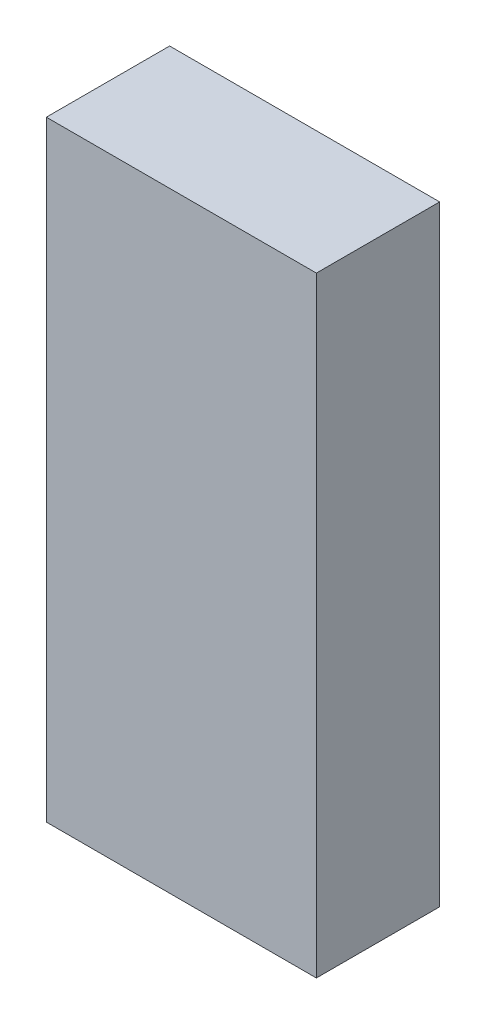
ISO-10303-21;
HEADER;
FILE_DESCRIPTION(('STEP AP214'),'2;1');
FILE_NAME('part.step','',(''),(''),'','','');
FILE_SCHEMA(('AUTOMOTIVE_DESIGN { 1 0 10303 214 1 1 1 1 }'));
ENDSEC;
DATA;
#1=APPLICATION_CONTEXT('core data for automotive mechanical design processes');
#2=APPLICATION_PROTOCOL_DEFINITION('international standard','automotive_design',2000,#1);
#3=PRODUCT_CONTEXT('',#1,'mechanical');
#4=PRODUCT('Part','Part','',(#3));
#5=PRODUCT_RELATED_PRODUCT_CATEGORY('part','',(#4));
#6=PRODUCT_DEFINITION_FORMATION('','',#4);
#7=PRODUCT_DEFINITION_CONTEXT('part definition',#1,'design');
#8=PRODUCT_DEFINITION('design','',#6,#7);
#9=PRODUCT_DEFINITION_SHAPE('','',#8);
#10=(LENGTH_UNIT() NAMED_UNIT(*) SI_UNIT(.MILLI.,.METRE.));
#11=(NAMED_UNIT(*) PLANE_ANGLE_UNIT() SI_UNIT($,.RADIAN.));
#12=(NAMED_UNIT(*) SI_UNIT($,.STERADIAN.) SOLID_ANGLE_UNIT());
#13=UNCERTAINTY_MEASURE_WITH_UNIT(LENGTH_MEASURE(1.E-05),#10,'distance_accuracy_value','');
#14=(GEOMETRIC_REPRESENTATION_CONTEXT(3) GLOBAL_UNCERTAINTY_ASSIGNED_CONTEXT((#13)) GLOBAL_UNIT_ASSIGNED_CONTEXT((#10,
#11,#12)) REPRESENTATION_CONTEXT('',''));
#15=CARTESIAN_POINT('',(0.,0.,0.));
#16=DIRECTION('',(0.,0.,1.));
#17=DIRECTION('',(1.,0.,0.));
#18=AXIS2_PLACEMENT_3D('',#15,#16,#17);
#19=CARTESIAN_POINT('',(1.27000000552E-06,0.,2.10000088));
#20=DIRECTION('',(0.,0.,1.));
#21=DIRECTION('',(1.,0.,0.));
#22=AXIS2_PLACEMENT_3D('',#19,#20,#21);
#23=PLANE('',#22);
#24=DIRECTION('',(0.,-1.,0.));
#25=VECTOR('',#24,1.);
#26=CARTESIAN_POINT('',(-2.29999794,5.19999976,2.10000088));
#27=LINE('',#26,#25);
#28=CARTESIAN_POINT('',(-2.29999794,5.19999976,2.10000088));
#29=VERTEX_POINT('',#28);
#30=CARTESIAN_POINT('',(-2.29999794,-5.19999976,2.10000088));
#31=VERTEX_POINT('',#30);
#32=EDGE_CURVE('E81',#29,#31,#27,.T.);
#33=ORIENTED_EDGE('',*,*,#32,.T.);
#34=DIRECTION('',(1.,0.,0.));
#35=VECTOR('',#34,1.);
#36=CARTESIAN_POINT('',(-2.29999794,-5.19999976,2.10000088));
#37=LINE('',#36,#35);
#38=CARTESIAN_POINT('',(2.30000048,-5.19999976,2.10000088));
#39=VERTEX_POINT('',#38);
#40=EDGE_CURVE('E108',#31,#39,#37,.T.);
#41=ORIENTED_EDGE('',*,*,#40,.T.);
#42=DIRECTION('',(0.,1.,0.));
#43=VECTOR('',#42,1.);
#44=CARTESIAN_POINT('',(2.30000048,-5.19999976,2.10000088));
#45=LINE('',#44,#43);
#46=CARTESIAN_POINT('',(2.30000048,5.19999976,2.10000088));
#47=VERTEX_POINT('',#46);
#48=EDGE_CURVE('E74',#39,#47,#45,.T.);
#49=ORIENTED_EDGE('',*,*,#48,.T.);
#50=DIRECTION('',(-1.,0.,0.));
#51=VECTOR('',#50,1.);
#52=CARTESIAN_POINT('',(2.30000048,5.19999976,2.10000088));
#53=LINE('',#52,#51);
#54=EDGE_CURVE('E11',#47,#29,#53,.T.);
#55=ORIENTED_EDGE('',*,*,#54,.T.);
#56=EDGE_LOOP('',(#33,#41,#49,#55));
#57=FACE_BOUND('',#56,.T.);
#58=ADVANCED_FACE('F17',(#57),#23,.T.);
#59=CARTESIAN_POINT('',(1.27000000552E-06,0.,0.));
#60=DIRECTION('',(0.,0.,1.));
#61=DIRECTION('',(1.,0.,0.));
#62=AXIS2_PLACEMENT_3D('',#59,#60,#61);
#63=PLANE('',#62);
#64=DIRECTION('',(-1.,0.,0.));
#65=VECTOR('',#64,1.);
#66=CARTESIAN_POINT('',(2.30000048,5.19999976,0.));
#67=LINE('',#66,#65);
#68=CARTESIAN_POINT('',(2.30000048,5.19999976,0.));
#69=VERTEX_POINT('',#68);
#70=CARTESIAN_POINT('',(-2.29999794,5.19999976,0.));
#71=VERTEX_POINT('',#70);
#72=EDGE_CURVE('E25',#69,#71,#67,.T.);
#73=ORIENTED_EDGE('',*,*,#72,.F.);
#74=DIRECTION('',(0.,1.,0.));
#75=VECTOR('',#74,1.);
#76=CARTESIAN_POINT('',(2.30000048,-5.19999976,0.));
#77=LINE('',#76,#75);
#78=CARTESIAN_POINT('',(2.30000048,-5.19999976,0.));
#79=VERTEX_POINT('',#78);
#80=EDGE_CURVE('E101',#79,#69,#77,.T.);
#81=ORIENTED_EDGE('',*,*,#80,.F.);
#82=DIRECTION('',(1.,0.,0.));
#83=VECTOR('',#82,1.);
#84=CARTESIAN_POINT('',(-2.29999794,-5.19999976,0.));
#85=LINE('',#84,#83);
#86=CARTESIAN_POINT('',(-2.29999794,-5.19999976,0.));
#87=VERTEX_POINT('',#86);
#88=EDGE_CURVE('E83',#87,#79,#85,.T.);
#89=ORIENTED_EDGE('',*,*,#88,.F.);
#90=DIRECTION('',(0.,-1.,0.));
#91=VECTOR('',#90,1.);
#92=CARTESIAN_POINT('',(-2.29999794,5.19999976,0.));
#93=LINE('',#92,#91);
#94=EDGE_CURVE('E79',#71,#87,#93,.T.);
#95=ORIENTED_EDGE('',*,*,#94,.F.);
#96=EDGE_LOOP('',(#73,#81,#89,#95));
#97=FACE_BOUND('',#96,.T.);
#98=ADVANCED_FACE('F85',(#97),#63,.F.);
#99=CARTESIAN_POINT('',(2.30000048,5.19999976,0.));
#100=DIRECTION('',(0.,-1.,0.));
#101=DIRECTION('',(0.,0.,-1.));
#102=AXIS2_PLACEMENT_3D('',#99,#100,#101);
#103=PLANE('',#102);
#104=ORIENTED_EDGE('',*,*,#72,.T.);
#105=DIRECTION('',(0.,0.,1.));
#106=VECTOR('',#105,1.);
#107=CARTESIAN_POINT('',(-2.29999794,5.19999976,0.));
#108=LINE('',#107,#106);
#109=EDGE_CURVE('E68',#71,#29,#108,.T.);
#110=ORIENTED_EDGE('',*,*,#109,.T.);
#111=ORIENTED_EDGE('',*,*,#54,.F.);
#112=DIRECTION('',(0.,0.,1.));
#113=VECTOR('',#112,1.);
#114=CARTESIAN_POINT('',(2.30000048,5.19999976,0.));
#115=LINE('',#114,#113);
#116=EDGE_CURVE('E71',#69,#47,#115,.T.);
#117=ORIENTED_EDGE('',*,*,#116,.F.);
#118=EDGE_LOOP('',(#104,#110,#111,#117));
#119=FACE_BOUND('',#118,.T.);
#120=ADVANCED_FACE('F67',(#119),#103,.F.);
#121=CARTESIAN_POINT('',(2.30000048,-5.19999976,0.));
#122=DIRECTION('',(-1.,0.,0.));
#123=DIRECTION('',(0.,0.,1.));
#124=AXIS2_PLACEMENT_3D('',#121,#122,#123);
#125=PLANE('',#124);
#126=ORIENTED_EDGE('',*,*,#80,.T.);
#127=ORIENTED_EDGE('',*,*,#116,.T.);
#128=ORIENTED_EDGE('',*,*,#48,.F.);
#129=DIRECTION('',(0.,0.,1.));
#130=VECTOR('',#129,1.);
#131=CARTESIAN_POINT('',(2.30000048,-5.19999976,0.));
#132=LINE('',#131,#130);
#133=EDGE_CURVE('E104',#79,#39,#132,.T.);
#134=ORIENTED_EDGE('',*,*,#133,.F.);
#135=EDGE_LOOP('',(#126,#127,#128,#134));
#136=FACE_BOUND('',#135,.T.);
#137=ADVANCED_FACE('F119',(#136),#125,.F.);
#138=CARTESIAN_POINT('',(-2.29999794,-5.19999976,0.));
#139=DIRECTION('',(0.,1.,0.));
#140=DIRECTION('',(1.,0.,0.));
#141=AXIS2_PLACEMENT_3D('',#138,#139,#140);
#142=PLANE('',#141);
#143=ORIENTED_EDGE('',*,*,#88,.T.);
#144=ORIENTED_EDGE('',*,*,#133,.T.);
#145=ORIENTED_EDGE('',*,*,#40,.F.);
#146=DIRECTION('',(0.,0.,1.));
#147=VECTOR('',#146,1.);
#148=CARTESIAN_POINT('',(-2.29999794,-5.19999976,0.));
#149=LINE('',#148,#147);
#150=EDGE_CURVE('E89',#87,#31,#149,.T.);
#151=ORIENTED_EDGE('',*,*,#150,.F.);
#152=EDGE_LOOP('',(#143,#144,#145,#151));
#153=FACE_BOUND('',#152,.T.);
#154=ADVANCED_FACE('F121',(#153),#142,.F.);
#155=CARTESIAN_POINT('',(-2.29999794,5.19999976,0.));
#156=DIRECTION('',(1.,0.,0.));
#157=DIRECTION('',(0.,1.,0.));
#158=AXIS2_PLACEMENT_3D('',#155,#156,#157);
#159=PLANE('',#158);
#160=ORIENTED_EDGE('',*,*,#94,.T.);
#161=ORIENTED_EDGE('',*,*,#150,.T.);
#162=ORIENTED_EDGE('',*,*,#32,.F.);
#163=ORIENTED_EDGE('',*,*,#109,.F.);
#164=EDGE_LOOP('',(#160,#161,#162,#163));
#165=FACE_BOUND('',#164,.T.);
#166=ADVANCED_FACE('F77',(#165),#159,.F.);
#167=CLOSED_SHELL('',(#58,#98,#120,#137,#154,#166));
#168=MANIFOLD_SOLID_BREP('B1',#167);
#169=ADVANCED_BREP_SHAPE_REPRESENTATION('',(#18,#168),#14);
#170=SHAPE_DEFINITION_REPRESENTATION(#9,#169);
ENDSEC;
END-ISO-10303-21;
